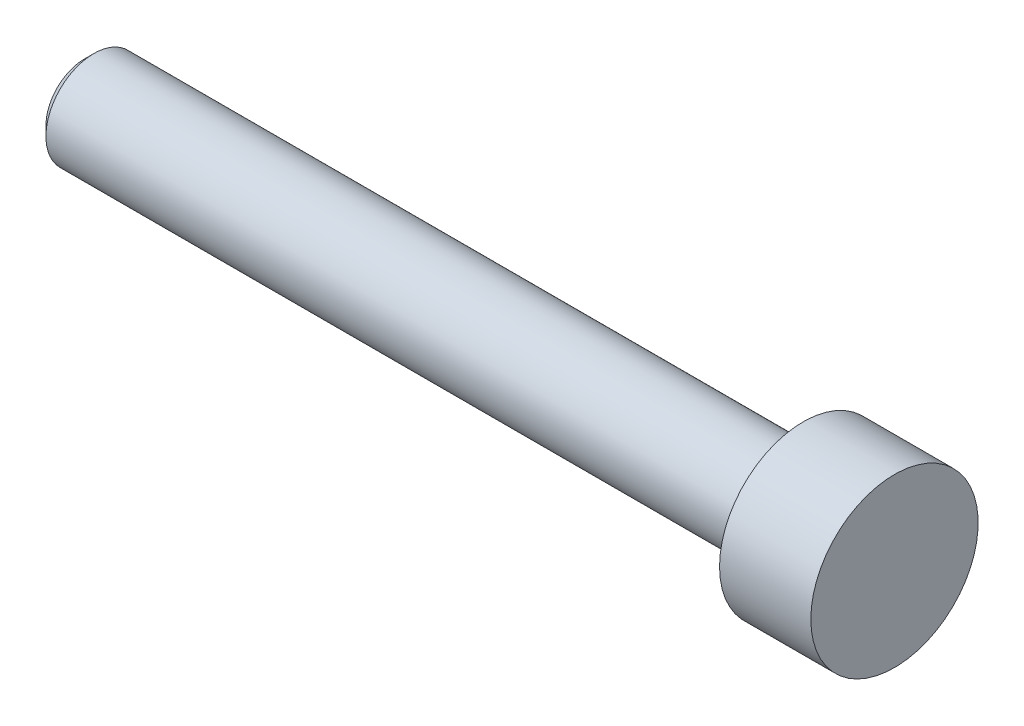
ISO-10303-21;
HEADER;
FILE_DESCRIPTION(('STEP AP214'),'2;1');
FILE_NAME('part.step','',(''),(''),'','','');
FILE_SCHEMA(('AUTOMOTIVE_DESIGN { 1 0 10303 214 1 1 1 1 }'));
ENDSEC;
DATA;
#1=APPLICATION_CONTEXT('core data for automotive mechanical design processes');
#2=APPLICATION_PROTOCOL_DEFINITION('international standard','automotive_design',2000,#1);
#3=PRODUCT_CONTEXT('',#1,'mechanical');
#4=PRODUCT('Part','Part','',(#3));
#5=PRODUCT_RELATED_PRODUCT_CATEGORY('part','',(#4));
#6=PRODUCT_DEFINITION_FORMATION('','',#4);
#7=PRODUCT_DEFINITION_CONTEXT('part definition',#1,'design');
#8=PRODUCT_DEFINITION('design','',#6,#7);
#9=PRODUCT_DEFINITION_SHAPE('','',#8);
#10=(LENGTH_UNIT() NAMED_UNIT(*) SI_UNIT(.MILLI.,.METRE.));
#11=(NAMED_UNIT(*) PLANE_ANGLE_UNIT() SI_UNIT($,.RADIAN.));
#12=(NAMED_UNIT(*) SI_UNIT($,.STERADIAN.) SOLID_ANGLE_UNIT());
#13=UNCERTAINTY_MEASURE_WITH_UNIT(LENGTH_MEASURE(1.E-05),#10,'distance_accuracy_value','');
#14=(GEOMETRIC_REPRESENTATION_CONTEXT(3) GLOBAL_UNCERTAINTY_ASSIGNED_CONTEXT((#13)) GLOBAL_UNIT_ASSIGNED_CONTEXT((#10,
#11,#12)) REPRESENTATION_CONTEXT('',''));
#15=CARTESIAN_POINT('',(0.,0.,0.));
#16=DIRECTION('',(0.,0.,1.));
#17=DIRECTION('',(1.,0.,0.));
#18=AXIS2_PLACEMENT_3D('',#15,#16,#17);
#19=CARTESIAN_POINT('',(29.999999944,0.,0.));
#20=DIRECTION('',(1.,0.,0.));
#21=DIRECTION('',(0.,0.,-1.));
#22=AXIS2_PLACEMENT_3D('',#19,#20,#21);
#23=PLANE('',#22);
#24=CARTESIAN_POINT('',(29.999999944,0.,0.));
#25=DIRECTION('',(-1.,0.,0.));
#26=DIRECTION('',(0.,0.,1.));
#27=AXIS2_PLACEMENT_3D('',#24,#25,#26);
#28=CIRCLE('',#27,3.49250000000001);
#29=CARTESIAN_POINT('',(29.999999944,0.,3.4925));
#30=VERTEX_POINT('',#29);
#31=EDGE_CURVE('E10',#30,#30,#28,.T.);
#32=ORIENTED_EDGE('',*,*,#31,.T.);
#33=EDGE_LOOP('',(#32));
#34=FACE_BOUND('',#33,.T.);
#35=CARTESIAN_POINT('',(29.999999944,0.,0.));
#36=DIRECTION('',(1.,0.,0.));
#37=DIRECTION('',(0.,0.,-1.));
#38=AXIS2_PLACEMENT_3D('',#35,#36,#37);
#39=CIRCLE('',#38,2.);
#40=CARTESIAN_POINT('',(29.999999944,0.,-2.));
#41=VERTEX_POINT('',#40);
#42=EDGE_CURVE('E56',#41,#41,#39,.T.);
#43=ORIENTED_EDGE('',*,*,#42,.T.);
#44=EDGE_LOOP('',(#43));
#45=FACE_BOUND('',#44,.T.);
#46=ADVANCED_FACE('F45',(#34,#45),#23,.F.);
#47=CARTESIAN_POINT('',(0.,0.,0.));
#48=DIRECTION('',(-1.,0.,0.));
#49=DIRECTION('',(0.,0.,1.));
#50=AXIS2_PLACEMENT_3D('',#47,#48,#49);
#51=CYLINDRICAL_SURFACE('',#50,3.49250000000001);
#52=ORIENTED_EDGE('',*,*,#31,.F.);
#53=EDGE_LOOP('',(#52));
#54=FACE_BOUND('',#53,.T.);
#55=CARTESIAN_POINT('',(33.809999944,0.,0.));
#56=DIRECTION('',(-1.,0.,0.));
#57=DIRECTION('',(0.,0.,1.));
#58=AXIS2_PLACEMENT_3D('',#55,#56,#57);
#59=CIRCLE('',#58,3.49250000000001);
#60=CARTESIAN_POINT('',(33.809999944,0.,3.49250000000001));
#61=VERTEX_POINT('',#60);
#62=EDGE_CURVE('E52',#61,#61,#59,.T.);
#63=ORIENTED_EDGE('',*,*,#62,.T.);
#64=EDGE_LOOP('',(#63));
#65=FACE_BOUND('',#64,.T.);
#66=ADVANCED_FACE('F82',(#54,#65),#51,.T.);
#67=CARTESIAN_POINT('',(33.809999944,0.,0.));
#68=DIRECTION('',(-1.,0.,0.));
#69=DIRECTION('',(0.,0.,1.));
#70=AXIS2_PLACEMENT_3D('',#67,#68,#69);
#71=PLANE('',#70);
#72=ORIENTED_EDGE('',*,*,#62,.F.);
#73=EDGE_LOOP('',(#72));
#74=FACE_BOUND('',#73,.T.);
#75=ADVANCED_FACE('F88',(#74),#71,.F.);
#76=CARTESIAN_POINT('',(0.,0.,0.));
#77=DIRECTION('',(1.,0.,0.));
#78=DIRECTION('',(0.,0.,-1.));
#79=AXIS2_PLACEMENT_3D('',#76,#77,#78);
#80=CYLINDRICAL_SURFACE('',#79,2.);
#81=ORIENTED_EDGE('',*,*,#42,.F.);
#82=EDGE_LOOP('',(#81));
#83=FACE_BOUND('',#82,.T.);
#84=CARTESIAN_POINT('',(0.389999999999996,0.,0.));
#85=DIRECTION('',(1.,0.,0.));
#86=DIRECTION('',(0.,0.,-1.));
#87=AXIS2_PLACEMENT_3D('',#84,#85,#86);
#88=CIRCLE('',#87,2.);
#89=CARTESIAN_POINT('',(0.389999999999996,0.,-2.));
#90=VERTEX_POINT('',#89);
#91=EDGE_CURVE('E65',#90,#90,#88,.T.);
#92=ORIENTED_EDGE('',*,*,#91,.T.);
#93=EDGE_LOOP('',(#92));
#94=FACE_BOUND('',#93,.T.);
#95=ADVANCED_FACE('F69',(#83,#94),#80,.T.);
#96=CARTESIAN_POINT('',(0.,0.,0.));
#97=DIRECTION('',(1.,0.,0.));
#98=DIRECTION('',(0.,0.,-1.));
#99=AXIS2_PLACEMENT_3D('',#96,#97,#98);
#100=CONICAL_SURFACE('',#99,1.61,0.785398163397449);
#101=ORIENTED_EDGE('',*,*,#91,.F.);
#102=EDGE_LOOP('',(#101));
#103=FACE_BOUND('',#102,.T.);
#104=CARTESIAN_POINT('',(0.,0.,0.));
#105=DIRECTION('',(1.,0.,0.));
#106=DIRECTION('',(0.,0.,-1.));
#107=AXIS2_PLACEMENT_3D('',#104,#105,#106);
#108=CIRCLE('',#107,1.61);
#109=CARTESIAN_POINT('',(0.,0.,-1.61));
#110=VERTEX_POINT('',#109);
#111=EDGE_CURVE('E60',#110,#110,#108,.T.);
#112=ORIENTED_EDGE('',*,*,#111,.T.);
#113=EDGE_LOOP('',(#112));
#114=FACE_BOUND('',#113,.T.);
#115=ADVANCED_FACE('F71',(#103,#114),#100,.T.);
#116=CARTESIAN_POINT('',(0.,0.,0.));
#117=DIRECTION('',(1.,0.,0.));
#118=DIRECTION('',(0.,0.,-1.));
#119=AXIS2_PLACEMENT_3D('',#116,#117,#118);
#120=PLANE('',#119);
#121=ORIENTED_EDGE('',*,*,#111,.F.);
#122=EDGE_LOOP('',(#121));
#123=FACE_BOUND('',#122,.T.);
#124=ADVANCED_FACE('F47',(#123),#120,.F.);
#125=CLOSED_SHELL('',(#46,#66,#75,#95,#115,#124));
#126=MANIFOLD_SOLID_BREP('B2',#125);
#127=ADVANCED_BREP_SHAPE_REPRESENTATION('',(#18,#126),#14);
#128=SHAPE_DEFINITION_REPRESENTATION(#9,#127);
ENDSEC;
END-ISO-10303-21;
